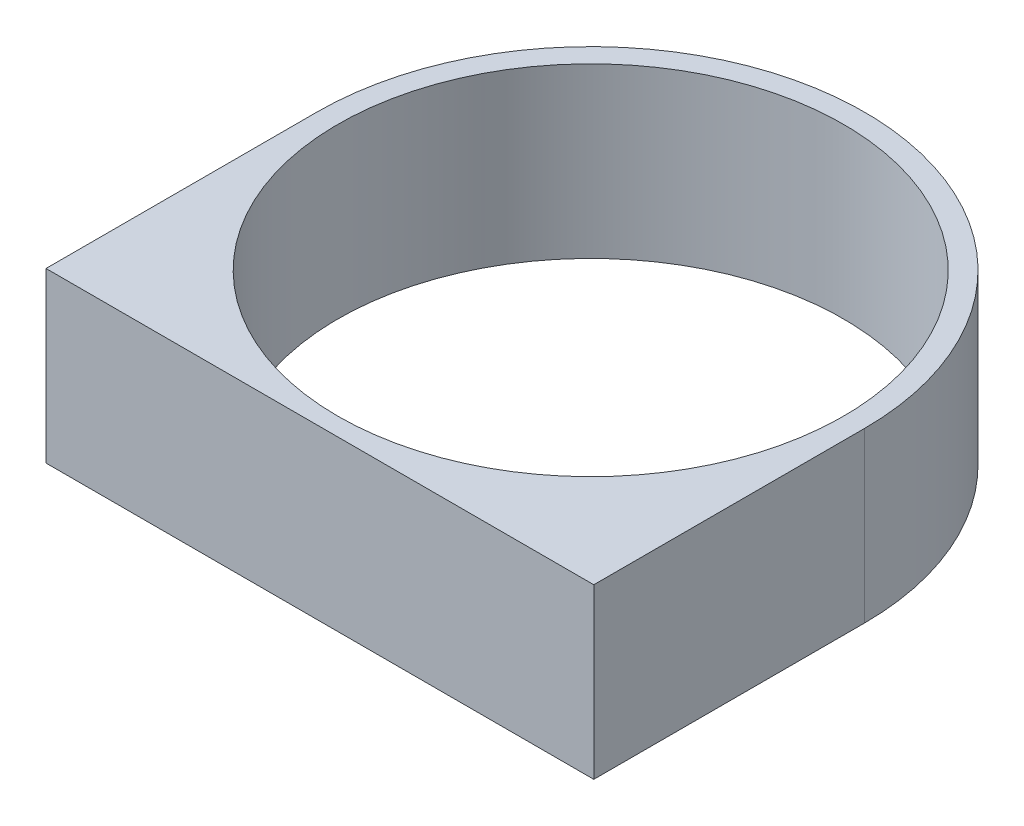
ISO-10303-21;
HEADER;
FILE_DESCRIPTION(('STEP AP214'),'2;1');
FILE_NAME('part.step','',(''),(''),'','','');
FILE_SCHEMA(('AUTOMOTIVE_DESIGN { 1 0 10303 214 1 1 1 1 }'));
ENDSEC;
DATA;
#1=APPLICATION_CONTEXT('core data for automotive mechanical design processes');
#2=APPLICATION_PROTOCOL_DEFINITION('international standard','automotive_design',2000,#1);
#3=PRODUCT_CONTEXT('',#1,'mechanical');
#4=PRODUCT('Part','Part','',(#3));
#5=PRODUCT_RELATED_PRODUCT_CATEGORY('part','',(#4));
#6=PRODUCT_DEFINITION_FORMATION('','',#4);
#7=PRODUCT_DEFINITION_CONTEXT('part definition',#1,'design');
#8=PRODUCT_DEFINITION('design','',#6,#7);
#9=PRODUCT_DEFINITION_SHAPE('','',#8);
#10=(LENGTH_UNIT() NAMED_UNIT(*) SI_UNIT(.MILLI.,.METRE.));
#11=(NAMED_UNIT(*) PLANE_ANGLE_UNIT() SI_UNIT($,.RADIAN.));
#12=(NAMED_UNIT(*) SI_UNIT($,.STERADIAN.) SOLID_ANGLE_UNIT());
#13=UNCERTAINTY_MEASURE_WITH_UNIT(LENGTH_MEASURE(1.E-05),#10,'distance_accuracy_value','');
#14=(GEOMETRIC_REPRESENTATION_CONTEXT(3) GLOBAL_UNCERTAINTY_ASSIGNED_CONTEXT((#13)) GLOBAL_UNIT_ASSIGNED_CONTEXT((#10,
#11,#12)) REPRESENTATION_CONTEXT('',''));
#15=CARTESIAN_POINT('',(0.,0.,0.));
#16=DIRECTION('',(0.,0.,1.));
#17=DIRECTION('',(1.,0.,0.));
#18=AXIS2_PLACEMENT_3D('',#15,#16,#17);
#19=CARTESIAN_POINT('',(0.,2.,0.));
#20=DIRECTION('',(0.,1.,0.));
#21=DIRECTION('',(0.,0.,1.));
#22=AXIS2_PLACEMENT_3D('',#19,#20,#21);
#23=PLANE('',#22);
#24=DIRECTION('',(1.,0.,0.));
#25=VECTOR('',#24,1.);
#26=CARTESIAN_POINT('',(0.250000000000001,2.,3.21340002342074));
#27=LINE('',#26,#25);
#28=CARTESIAN_POINT('',(-3.25,2.,3.21340002342074));
#29=VERTEX_POINT('',#28);
#30=CARTESIAN_POINT('',(3.25,2.,3.21340002342074));
#31=VERTEX_POINT('',#30);
#32=EDGE_CURVE('E50',#29,#31,#27,.T.);
#33=ORIENTED_EDGE('',*,*,#32,.T.);
#34=DIRECTION('',(0.,0.,-1.));
#35=VECTOR('',#34,1.);
#36=CARTESIAN_POINT('',(3.25,2.,3.21340002342074));
#37=LINE('',#36,#35);
#38=CARTESIAN_POINT('',(3.25,2.,0.));
#39=VERTEX_POINT('',#38);
#40=EDGE_CURVE('E81',#31,#39,#37,.T.);
#41=ORIENTED_EDGE('',*,*,#40,.T.);
#42=CARTESIAN_POINT('',(0.,2.,0.));
#43=DIRECTION('',(0.,1.,0.));
#44=DIRECTION('',(0.,0.,1.));
#45=AXIS2_PLACEMENT_3D('',#42,#43,#44);
#46=CIRCLE('',#45,3.25);
#47=CARTESIAN_POINT('',(-3.25,2.,0.));
#48=VERTEX_POINT('',#47);
#49=EDGE_CURVE('E85',#39,#48,#46,.T.);
#50=ORIENTED_EDGE('',*,*,#49,.T.);
#51=DIRECTION('',(0.,0.,1.));
#52=VECTOR('',#51,1.);
#53=CARTESIAN_POINT('',(-3.25,2.,0.));
#54=LINE('',#53,#52);
#55=EDGE_CURVE('E92',#48,#29,#54,.T.);
#56=ORIENTED_EDGE('',*,*,#55,.T.);
#57=EDGE_LOOP('',(#33,#41,#50,#56));
#58=FACE_BOUND('',#57,.T.);
#59=CARTESIAN_POINT('',(0.,2.,0.));
#60=DIRECTION('',(0.,1.,0.));
#61=DIRECTION('',(0.,0.,1.));
#62=AXIS2_PLACEMENT_3D('',#59,#60,#61);
#63=CIRCLE('',#62,3.);
#64=CARTESIAN_POINT('',(0.,2.,3.));
#65=VERTEX_POINT('',#64);
#66=EDGE_CURVE('E99',#65,#65,#63,.T.);
#67=ORIENTED_EDGE('',*,*,#66,.F.);
#68=EDGE_LOOP('',(#67));
#69=FACE_BOUND('',#68,.T.);
#70=ADVANCED_FACE('F33',(#58,#69),#23,.T.);
#71=CARTESIAN_POINT('',(0.,0.,0.));
#72=DIRECTION('',(0.,1.,0.));
#73=DIRECTION('',(0.,0.,1.));
#74=AXIS2_PLACEMENT_3D('',#71,#72,#73);
#75=PLANE('',#74);
#76=DIRECTION('',(0.,0.,-1.));
#77=VECTOR('',#76,1.);
#78=CARTESIAN_POINT('',(3.25,0.,3.21340002342074));
#79=LINE('',#78,#77);
#80=CARTESIAN_POINT('',(3.25,0.,3.21340002342074));
#81=VERTEX_POINT('',#80);
#82=CARTESIAN_POINT('',(3.25,0.,0.));
#83=VERTEX_POINT('',#82);
#84=EDGE_CURVE('E88',#81,#83,#79,.T.);
#85=ORIENTED_EDGE('',*,*,#84,.F.);
#86=DIRECTION('',(1.,0.,0.));
#87=VECTOR('',#86,1.);
#88=CARTESIAN_POINT('',(0.250000000000001,0.,3.21340002342074));
#89=LINE('',#88,#87);
#90=CARTESIAN_POINT('',(-3.25,0.,3.21340002342074));
#91=VERTEX_POINT('',#90);
#92=EDGE_CURVE('E102',#91,#81,#89,.T.);
#93=ORIENTED_EDGE('',*,*,#92,.F.);
#94=DIRECTION('',(0.,0.,1.));
#95=VECTOR('',#94,1.);
#96=CARTESIAN_POINT('',(-3.25,0.,0.));
#97=LINE('',#96,#95);
#98=CARTESIAN_POINT('',(-3.25,0.,0.));
#99=VERTEX_POINT('',#98);
#100=EDGE_CURVE('E75',#99,#91,#97,.T.);
#101=ORIENTED_EDGE('',*,*,#100,.F.);
#102=CARTESIAN_POINT('',(0.,0.,0.));
#103=DIRECTION('',(0.,1.,0.));
#104=DIRECTION('',(0.,0.,1.));
#105=AXIS2_PLACEMENT_3D('',#102,#103,#104);
#106=CIRCLE('',#105,3.25);
#107=EDGE_CURVE('E68',#83,#99,#106,.T.);
#108=ORIENTED_EDGE('',*,*,#107,.F.);
#109=EDGE_LOOP('',(#85,#93,#101,#108));
#110=FACE_BOUND('',#109,.T.);
#111=CARTESIAN_POINT('',(0.,0.,0.));
#112=DIRECTION('',(0.,1.,0.));
#113=DIRECTION('',(0.,0.,1.));
#114=AXIS2_PLACEMENT_3D('',#111,#112,#113);
#115=CIRCLE('',#114,3.);
#116=CARTESIAN_POINT('',(0.,0.,3.));
#117=VERTEX_POINT('',#116);
#118=EDGE_CURVE('E175',#117,#117,#115,.T.);
#119=ORIENTED_EDGE('',*,*,#118,.T.);
#120=EDGE_LOOP('',(#119));
#121=FACE_BOUND('',#120,.T.);
#122=ADVANCED_FACE('F108',(#110,#121),#75,.F.);
#123=CARTESIAN_POINT('',(3.25,2.,3.21340002342074));
#124=DIRECTION('',(-1.,0.,0.));
#125=DIRECTION('',(0.,0.,1.));
#126=AXIS2_PLACEMENT_3D('',#123,#124,#125);
#127=PLANE('',#126);
#128=ORIENTED_EDGE('',*,*,#84,.T.);
#129=DIRECTION('',(0.,-1.,0.));
#130=VECTOR('',#129,1.);
#131=CARTESIAN_POINT('',(3.25,2.,0.));
#132=LINE('',#131,#130);
#133=EDGE_CURVE('E42',#39,#83,#132,.T.);
#134=ORIENTED_EDGE('',*,*,#133,.F.);
#135=ORIENTED_EDGE('',*,*,#40,.F.);
#136=DIRECTION('',(0.,-1.,0.));
#137=VECTOR('',#136,1.);
#138=CARTESIAN_POINT('',(3.25,2.,3.21340002342074));
#139=LINE('',#138,#137);
#140=EDGE_CURVE('E11',#31,#81,#139,.T.);
#141=ORIENTED_EDGE('',*,*,#140,.T.);
#142=EDGE_LOOP('',(#128,#134,#135,#141));
#143=FACE_BOUND('',#142,.T.);
#144=ADVANCED_FACE('F35',(#143),#127,.F.);
#145=CARTESIAN_POINT('',(0.,2.,0.));
#146=DIRECTION('',(0.,-1.,0.));
#147=DIRECTION('',(0.,0.,-1.));
#148=AXIS2_PLACEMENT_3D('',#145,#146,#147);
#149=CYLINDRICAL_SURFACE('',#148,3.25);
#150=ORIENTED_EDGE('',*,*,#107,.T.);
#151=DIRECTION('',(0.,-1.,0.));
#152=VECTOR('',#151,1.);
#153=CARTESIAN_POINT('',(-3.25,2.,0.));
#154=LINE('',#153,#152);
#155=EDGE_CURVE('E89',#48,#99,#154,.T.);
#156=ORIENTED_EDGE('',*,*,#155,.F.);
#157=ORIENTED_EDGE('',*,*,#49,.F.);
#158=ORIENTED_EDGE('',*,*,#133,.T.);
#159=EDGE_LOOP('',(#150,#156,#157,#158));
#160=FACE_BOUND('',#159,.T.);
#161=ADVANCED_FACE('F90',(#160),#149,.T.);
#162=CARTESIAN_POINT('',(-3.25,2.,0.));
#163=DIRECTION('',(1.,0.,0.));
#164=DIRECTION('',(0.,0.,-1.));
#165=AXIS2_PLACEMENT_3D('',#162,#163,#164);
#166=PLANE('',#165);
#167=ORIENTED_EDGE('',*,*,#100,.T.);
#168=DIRECTION('',(0.,-1.,0.));
#169=VECTOR('',#168,1.);
#170=CARTESIAN_POINT('',(-3.25,2.,3.21340002342074));
#171=LINE('',#170,#169);
#172=EDGE_CURVE('E94',#29,#91,#171,.T.);
#173=ORIENTED_EDGE('',*,*,#172,.F.);
#174=ORIENTED_EDGE('',*,*,#55,.F.);
#175=ORIENTED_EDGE('',*,*,#155,.T.);
#176=EDGE_LOOP('',(#167,#173,#174,#175));
#177=FACE_BOUND('',#176,.T.);
#178=ADVANCED_FACE('F105',(#177),#166,.F.);
#179=CARTESIAN_POINT('',(0.250000000000001,2.,3.21340002342074));
#180=DIRECTION('',(0.,0.,-1.));
#181=DIRECTION('',(-1.,0.,0.));
#182=AXIS2_PLACEMENT_3D('',#179,#180,#181);
#183=PLANE('',#182);
#184=ORIENTED_EDGE('',*,*,#92,.T.);
#185=ORIENTED_EDGE('',*,*,#140,.F.);
#186=ORIENTED_EDGE('',*,*,#32,.F.);
#187=ORIENTED_EDGE('',*,*,#172,.T.);
#188=EDGE_LOOP('',(#184,#185,#186,#187));
#189=FACE_BOUND('',#188,.T.);
#190=ADVANCED_FACE('F110',(#189),#183,.F.);
#191=CARTESIAN_POINT('',(0.,2.,0.));
#192=DIRECTION('',(0.,-1.,0.));
#193=DIRECTION('',(0.,0.,-1.));
#194=AXIS2_PLACEMENT_3D('',#191,#192,#193);
#195=CYLINDRICAL_SURFACE('',#194,3.);
#196=ORIENTED_EDGE('',*,*,#66,.T.);
#197=EDGE_LOOP('',(#196));
#198=FACE_BOUND('',#197,.T.);
#199=ORIENTED_EDGE('',*,*,#118,.F.);
#200=EDGE_LOOP('',(#199));
#201=FACE_BOUND('',#200,.T.);
#202=ADVANCED_FACE('F112',(#198,#201),#195,.F.);
#203=CLOSED_SHELL('',(#70,#122,#144,#161,#178,#190,#202));
#204=MANIFOLD_SOLID_BREP('B2',#203);
#205=ADVANCED_BREP_SHAPE_REPRESENTATION('',(#18,#204),#14);
#206=SHAPE_DEFINITION_REPRESENTATION(#9,#205);
ENDSEC;
END-ISO-10303-21;
